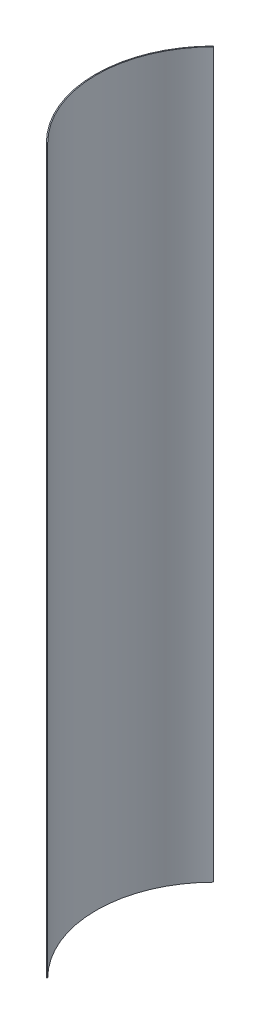
ISO-10303-21;
HEADER;
FILE_DESCRIPTION(('STEP AP214'),'2;1');
FILE_NAME('part.step','',(''),(''),'','','');
FILE_SCHEMA(('AUTOMOTIVE_DESIGN { 1 0 10303 214 1 1 1 1 }'));
ENDSEC;
DATA;
#1=APPLICATION_CONTEXT('core data for automotive mechanical design processes');
#2=APPLICATION_PROTOCOL_DEFINITION('international standard','automotive_design',2000,#1);
#3=PRODUCT_CONTEXT('',#1,'mechanical');
#4=PRODUCT('Part','Part','',(#3));
#5=PRODUCT_RELATED_PRODUCT_CATEGORY('part','',(#4));
#6=PRODUCT_DEFINITION_FORMATION('','',#4);
#7=PRODUCT_DEFINITION_CONTEXT('part definition',#1,'design');
#8=PRODUCT_DEFINITION('design','',#6,#7);
#9=PRODUCT_DEFINITION_SHAPE('','',#8);
#10=(LENGTH_UNIT() NAMED_UNIT(*) SI_UNIT(.MILLI.,.METRE.));
#11=(NAMED_UNIT(*) PLANE_ANGLE_UNIT() SI_UNIT($,.RADIAN.));
#12=(NAMED_UNIT(*) SI_UNIT($,.STERADIAN.) SOLID_ANGLE_UNIT());
#13=UNCERTAINTY_MEASURE_WITH_UNIT(LENGTH_MEASURE(1.E-05),#10,'distance_accuracy_value','');
#14=(GEOMETRIC_REPRESENTATION_CONTEXT(3) GLOBAL_UNCERTAINTY_ASSIGNED_CONTEXT((#13)) GLOBAL_UNIT_ASSIGNED_CONTEXT((#10,
#11,#12)) REPRESENTATION_CONTEXT('',''));
#15=CARTESIAN_POINT('',(0.,0.,0.));
#16=DIRECTION('',(0.,0.,1.));
#17=DIRECTION('',(1.,0.,0.));
#18=AXIS2_PLACEMENT_3D('',#15,#16,#17);
#19=CARTESIAN_POINT('',(-3.33066907387547E-13,2989.,-2.22044604925031E-13));
#20=DIRECTION('',(0.,1.,0.));
#21=DIRECTION('',(0.,0.,1.));
#22=AXIS2_PLACEMENT_3D('',#19,#20,#21);
#23=PLANE('',#22);
#24=DIRECTION('',(-0.707106781186547,0.,0.707106781186548));
#25=VECTOR('',#24,1.);
#26=CARTESIAN_POINT('',(-691.196878609851,2989.,691.19687860985));
#27=LINE('',#26,#25);
#28=CARTESIAN_POINT('',(-685.540024360358,2989.,685.540024360357));
#29=VERTEX_POINT('',#28);
#30=CARTESIAN_POINT('',(-691.196878609851,2989.,691.19687860985));
#31=VERTEX_POINT('',#30);
#32=EDGE_CURVE('E11',#29,#31,#27,.T.);
#33=ORIENTED_EDGE('',*,*,#32,.F.);
#34=CARTESIAN_POINT('',(-3.33066907387547E-13,2989.,-2.22044604925031E-13));
#35=DIRECTION('',(0.,-1.,0.));
#36=DIRECTION('',(0.,0.,-1.));
#37=AXIS2_PLACEMENT_3D('',#34,#35,#36);
#38=CIRCLE('',#37,969.5);
#39=CARTESIAN_POINT('',(-685.54002436036,2989.,-685.540024360356));
#40=VERTEX_POINT('',#39);
#41=EDGE_CURVE('E72',#29,#40,#38,.T.);
#42=ORIENTED_EDGE('',*,*,#41,.T.);
#43=DIRECTION('',(-0.707106781186549,0.,-0.707106781186546));
#44=VECTOR('',#43,1.);
#45=CARTESIAN_POINT('',(-691.196878609852,2989.,-691.196878609849));
#46=LINE('',#45,#44);
#47=CARTESIAN_POINT('',(-691.196878609852,2989.,-691.196878609849));
#48=VERTEX_POINT('',#47);
#49=EDGE_CURVE('E46',#40,#48,#46,.T.);
#50=ORIENTED_EDGE('',*,*,#49,.T.);
#51=CARTESIAN_POINT('',(-3.33066907387547E-13,2989.,-2.22044604925031E-13));
#52=DIRECTION('',(0.,-1.,0.));
#53=DIRECTION('',(0.,0.,-1.));
#54=AXIS2_PLACEMENT_3D('',#51,#52,#53);
#55=CIRCLE('',#54,977.5);
#56=EDGE_CURVE('E75',#31,#48,#55,.T.);
#57=ORIENTED_EDGE('',*,*,#56,.F.);
#58=EDGE_LOOP('',(#33,#42,#50,#57));
#59=FACE_BOUND('',#58,.T.);
#60=ADVANCED_FACE('F36',(#59),#23,.T.);
#61=CARTESIAN_POINT('',(-691.196878609852,2.66453525910038E-12,-691.196878609849));
#62=DIRECTION('',(0.707106781186546,0.,-0.707106781186549));
#63=DIRECTION('',(0.,-1.,0.));
#64=AXIS2_PLACEMENT_3D('',#61,#62,#63);
#65=PLANE('',#64);
#66=ORIENTED_EDGE('',*,*,#49,.F.);
#67=DIRECTION('',(0.,-1.,0.));
#68=VECTOR('',#67,1.);
#69=CARTESIAN_POINT('',(-685.54002436036,6171.76038453891,-685.540024360356));
#70=LINE('',#69,#68);
#71=CARTESIAN_POINT('',(-685.54002436036,-2988.99999999999,-685.540024360356));
#72=VERTEX_POINT('',#71);
#73=EDGE_CURVE('E87',#40,#72,#70,.T.);
#74=ORIENTED_EDGE('',*,*,#73,.T.);
#75=DIRECTION('',(-0.707106781186549,0.,-0.707106781186546));
#76=VECTOR('',#75,1.);
#77=CARTESIAN_POINT('',(-691.196878609852,-2989.,-691.196878609849));
#78=LINE('',#77,#76);
#79=CARTESIAN_POINT('',(-691.196878609852,-2989.,-691.196878609849));
#80=VERTEX_POINT('',#79);
#81=EDGE_CURVE('E96',#72,#80,#78,.T.);
#82=ORIENTED_EDGE('',*,*,#81,.T.);
#83=DIRECTION('',(0.,-1.,0.));
#84=VECTOR('',#83,1.);
#85=CARTESIAN_POINT('',(-691.196878609852,2989.,-691.196878609849));
#86=LINE('',#85,#84);
#87=EDGE_CURVE('E91',#48,#80,#86,.T.);
#88=ORIENTED_EDGE('',*,*,#87,.F.);
#89=EDGE_LOOP('',(#66,#74,#82,#88));
#90=FACE_BOUND('',#89,.T.);
#91=ADVANCED_FACE('F104',(#90),#65,.T.);
#92=CARTESIAN_POINT('',(-3.33066907387547E-13,-2989.,-2.22044604925031E-13));
#93=DIRECTION('',(0.,-1.,0.));
#94=DIRECTION('',(0.,0.,-1.));
#95=AXIS2_PLACEMENT_3D('',#92,#93,#94);
#96=PLANE('',#95);
#97=ORIENTED_EDGE('',*,*,#81,.F.);
#98=CARTESIAN_POINT('',(-3.33066907387547E-13,-2988.99999999999,-2.22044604925031E-13));
#99=DIRECTION('',(0.,-1.,0.));
#100=DIRECTION('',(0.,0.,-1.));
#101=AXIS2_PLACEMENT_3D('',#98,#99,#100);
#102=CIRCLE('',#101,969.5);
#103=CARTESIAN_POINT('',(-685.540024360358,-2988.99999999999,685.540024360357));
#104=VERTEX_POINT('',#103);
#105=EDGE_CURVE('E89',#72,#104,#102,.F.);
#106=ORIENTED_EDGE('',*,*,#105,.T.);
#107=DIRECTION('',(-0.707106781186548,0.,0.707106781186547));
#108=VECTOR('',#107,1.);
#109=CARTESIAN_POINT('',(-691.196878609851,-2989.,691.196878609849));
#110=LINE('',#109,#108);
#111=CARTESIAN_POINT('',(-691.196878609851,-2989.,691.196878609849));
#112=VERTEX_POINT('',#111);
#113=EDGE_CURVE('E40',#104,#112,#110,.T.);
#114=ORIENTED_EDGE('',*,*,#113,.T.);
#115=CARTESIAN_POINT('',(-3.33066907387547E-13,-2989.,-2.22044604925031E-13));
#116=DIRECTION('',(0.,1.,0.));
#117=DIRECTION('',(0.,0.,1.));
#118=AXIS2_PLACEMENT_3D('',#115,#116,#117);
#119=CIRCLE('',#118,977.5);
#120=EDGE_CURVE('E105',#80,#112,#119,.T.);
#121=ORIENTED_EDGE('',*,*,#120,.F.);
#122=EDGE_LOOP('',(#97,#106,#114,#121));
#123=FACE_BOUND('',#122,.T.);
#124=ADVANCED_FACE('F109',(#123),#96,.T.);
#125=CARTESIAN_POINT('',(-691.196878609851,2.66453525910038E-12,691.196878609849));
#126=DIRECTION('',(0.707106781186547,0.,0.707106781186548));
#127=DIRECTION('',(0.,1.,0.));
#128=AXIS2_PLACEMENT_3D('',#125,#126,#127);
#129=PLANE('',#128);
#130=DIRECTION('',(0.,-1.,0.));
#131=VECTOR('',#130,1.);
#132=CARTESIAN_POINT('',(-685.540024360358,6171.76038453891,685.540024360357));
#133=LINE('',#132,#131);
#134=EDGE_CURVE('E85',#104,#29,#133,.F.);
#135=ORIENTED_EDGE('',*,*,#134,.T.);
#136=ORIENTED_EDGE('',*,*,#32,.T.);
#137=DIRECTION('',(0.,1.,0.));
#138=VECTOR('',#137,1.);
#139=CARTESIAN_POINT('',(-691.196878609851,-2989.,691.196878609849));
#140=LINE('',#139,#138);
#141=EDGE_CURVE('E103',#112,#31,#140,.T.);
#142=ORIENTED_EDGE('',*,*,#141,.F.);
#143=ORIENTED_EDGE('',*,*,#113,.F.);
#144=EDGE_LOOP('',(#135,#136,#142,#143));
#145=FACE_BOUND('',#144,.T.);
#146=ADVANCED_FACE('F38',(#145),#129,.T.);
#147=CARTESIAN_POINT('',(-3.33066907387547E-13,6171.76038453891,-2.22044604925031E-13));
#148=DIRECTION('',(0.,-1.,0.));
#149=DIRECTION('',(0.,0.,-1.));
#150=AXIS2_PLACEMENT_3D('',#147,#148,#149);
#151=CYLINDRICAL_SURFACE('',#150,977.5);
#152=ORIENTED_EDGE('',*,*,#120,.T.);
#153=ORIENTED_EDGE('',*,*,#141,.T.);
#154=ORIENTED_EDGE('',*,*,#56,.T.);
#155=ORIENTED_EDGE('',*,*,#87,.T.);
#156=EDGE_LOOP('',(#152,#153,#154,#155));
#157=FACE_BOUND('',#156,.T.);
#158=ADVANCED_FACE('F102',(#157),#151,.T.);
#159=CARTESIAN_POINT('',(-3.33066907387547E-13,6171.76038453891,-2.22044604925031E-13));
#160=DIRECTION('',(0.,-1.,0.));
#161=DIRECTION('',(0.,0.,-1.));
#162=AXIS2_PLACEMENT_3D('',#159,#160,#161);
#163=CYLINDRICAL_SURFACE('',#162,969.5);
#164=ORIENTED_EDGE('',*,*,#105,.F.);
#165=ORIENTED_EDGE('',*,*,#73,.F.);
#166=ORIENTED_EDGE('',*,*,#41,.F.);
#167=ORIENTED_EDGE('',*,*,#134,.F.);
#168=EDGE_LOOP('',(#164,#165,#166,#167));
#169=FACE_BOUND('',#168,.T.);
#170=ADVANCED_FACE('F84',(#169),#163,.F.);
#171=CLOSED_SHELL('',(#60,#91,#124,#146,#158,#170));
#172=MANIFOLD_SOLID_BREP('B2',#171);
#173=ADVANCED_BREP_SHAPE_REPRESENTATION('',(#18,#172),#14);
#174=SHAPE_DEFINITION_REPRESENTATION(#9,#173);
ENDSEC;
END-ISO-10303-21;
